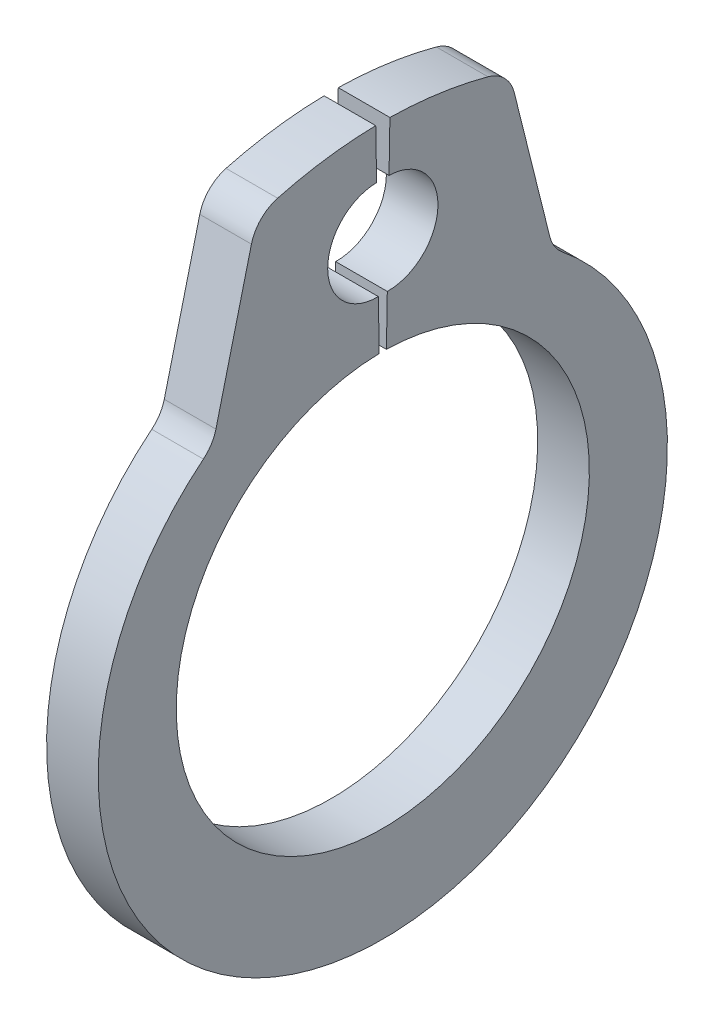
ISO-10303-21;
HEADER;
FILE_DESCRIPTION(('STEP AP214'),'2;1');
FILE_NAME('part.step','',(''),(''),'','','');
FILE_SCHEMA(('AUTOMOTIVE_DESIGN { 1 0 10303 214 1 1 1 1 }'));
ENDSEC;
DATA;
#1=APPLICATION_CONTEXT('core data for automotive mechanical design processes');
#2=APPLICATION_PROTOCOL_DEFINITION('international standard','automotive_design',2000,#1);
#3=PRODUCT_CONTEXT('',#1,'mechanical');
#4=PRODUCT('Part','Part','',(#3));
#5=PRODUCT_RELATED_PRODUCT_CATEGORY('part','',(#4));
#6=PRODUCT_DEFINITION_FORMATION('','',#4);
#7=PRODUCT_DEFINITION_CONTEXT('part definition',#1,'design');
#8=PRODUCT_DEFINITION('design','',#6,#7);
#9=PRODUCT_DEFINITION_SHAPE('','',#8);
#10=(LENGTH_UNIT() NAMED_UNIT(*) SI_UNIT(.MILLI.,.METRE.));
#11=(NAMED_UNIT(*) PLANE_ANGLE_UNIT() SI_UNIT($,.RADIAN.));
#12=(NAMED_UNIT(*) SI_UNIT($,.STERADIAN.) SOLID_ANGLE_UNIT());
#13=UNCERTAINTY_MEASURE_WITH_UNIT(LENGTH_MEASURE(1.E-05),#10,'distance_accuracy_value','');
#14=(GEOMETRIC_REPRESENTATION_CONTEXT(3) GLOBAL_UNCERTAINTY_ASSIGNED_CONTEXT((#13)) GLOBAL_UNIT_ASSIGNED_CONTEXT((#10,
#11,#12)) REPRESENTATION_CONTEXT('',''));
#15=CARTESIAN_POINT('',(0.,0.,0.));
#16=DIRECTION('',(0.,0.,1.));
#17=DIRECTION('',(1.,0.,0.));
#18=AXIS2_PLACEMENT_3D('',#15,#16,#17);
#19=CARTESIAN_POINT('',(0.35,0.,0.));
#20=DIRECTION('',(1.,0.,0.));
#21=DIRECTION('',(0.,0.,-1.));
#22=AXIS2_PLACEMENT_3D('',#19,#20,#21);
#23=PLANE('',#22);
#24=DIRECTION('',(0.,0.999847695156391,0.0174524064373034));
#25=VECTOR('',#24,1.);
#26=CARTESIAN_POINT('',(0.35,4.82426512913,0.08420786105989));
#27=LINE('',#26,#25);
#28=CARTESIAN_POINT('',(0.35,4.82426512912978,0.0842078610598862));
#29=VERTEX_POINT('',#28);
#30=CARTESIAN_POINT('',(0.35,5.49916232336025,0.0959882354050645));
#31=VERTEX_POINT('',#30);
#32=EDGE_CURVE('E130',#29,#31,#27,.T.);
#33=ORIENTED_EDGE('',*,*,#32,.T.);
#34=CARTESIAN_POINT('',(0.35,0.,0.));
#35=DIRECTION('',(-1.,0.,0.));
#36=DIRECTION('',(0.,0.,1.));
#37=AXIS2_PLACEMENT_3D('',#34,#35,#36);
#38=CIRCLE('',#37,5.5);
#39=CARTESIAN_POINT('',(0.35,5.31203501838707,1.42558197359135));
#40=VERTEX_POINT('',#39);
#41=EDGE_CURVE('E126',#31,#40,#38,.F.);
#42=ORIENTED_EDGE('',*,*,#41,.T.);
#43=CARTESIAN_POINT('',(0.35,4.829122743988,1.295983612356));
#44=DIRECTION('',(-1.,0.,0.));
#45=DIRECTION('',(0.,0.,1.));
#46=AXIS2_PLACEMENT_3D('',#43,#44,#45);
#47=CIRCLE('',#46,0.5);
#48=CARTESIAN_POINT('',(0.35,4.95008369178782,1.78113147549359));
#49=VERTEX_POINT('',#48);
#50=EDGE_CURVE('E20',#40,#49,#47,.F.);
#51=ORIENTED_EDGE('',*,*,#50,.T.);
#52=DIRECTION('',(0.,0.970295726275989,-0.241921895599697));
#53=VECTOR('',#52,1.);
#54=CARTESIAN_POINT('',(0.35,5.226710833704,1.712160582667));
#55=LINE('',#54,#53);
#56=CARTESIAN_POINT('',(0.35,3.01966775566306,2.26243822550396));
#57=VERTEX_POINT('',#56);
#58=EDGE_CURVE('E133',#49,#57,#55,.F.);
#59=ORIENTED_EDGE('',*,*,#58,.T.);
#60=CARTESIAN_POINT('',(0.35,3.140628703463,2.747586088642));
#61=DIRECTION('',(-1.,0.,0.));
#62=DIRECTION('',(0.,0.,1.));
#63=AXIS2_PLACEMENT_3D('',#60,#61,#62);
#64=CIRCLE('',#63,0.5);
#65=CARTESIAN_POINT('',(0.35,2.75252456841165,2.43234779725633));
#66=VERTEX_POINT('',#65);
#67=EDGE_CURVE('E212',#57,#66,#64,.T.);
#68=ORIENTED_EDGE('',*,*,#67,.T.);
#69=CARTESIAN_POINT('',(0.35,-0.2420489456372,0.));
#70=DIRECTION('',(-1.,0.,0.));
#71=DIRECTION('',(0.,0.,1.));
#72=AXIS2_PLACEMENT_3D('',#69,#70,#71);
#73=CIRCLE('',#72,3.857951054363);
#74=CARTESIAN_POINT('',(0.35,2.75252456841143,-2.43234779725615));
#75=VERTEX_POINT('',#74);
#76=EDGE_CURVE('E209',#75,#66,#73,.T.);
#77=ORIENTED_EDGE('',*,*,#76,.F.);
#78=CARTESIAN_POINT('',(0.35,3.140628703463,-2.747586088642));
#79=DIRECTION('',(-1.,0.,0.));
#80=DIRECTION('',(0.,0.,1.));
#81=AXIS2_PLACEMENT_3D('',#78,#79,#80);
#82=CIRCLE('',#81,0.5);
#83=CARTESIAN_POINT('',(0.35,3.01966775566305,-2.26243822550389));
#84=VERTEX_POINT('',#83);
#85=EDGE_CURVE('E206',#75,#84,#82,.T.);
#86=ORIENTED_EDGE('',*,*,#85,.T.);
#87=DIRECTION('',(0.,-0.970295726275989,-0.241921895599697));
#88=VECTOR('',#87,1.);
#89=CARTESIAN_POINT('',(0.35,5.226710833704,-1.712160582667));
#90=LINE('',#89,#88);
#91=CARTESIAN_POINT('',(0.35,4.95008369178782,-1.78113147549359));
#92=VERTEX_POINT('',#91);
#93=EDGE_CURVE('E163',#84,#92,#90,.F.);
#94=ORIENTED_EDGE('',*,*,#93,.T.);
#95=CARTESIAN_POINT('',(0.35,4.829122743988,-1.295983612356));
#96=DIRECTION('',(-1.,0.,0.));
#97=DIRECTION('',(0.,0.,1.));
#98=AXIS2_PLACEMENT_3D('',#95,#96,#97);
#99=CIRCLE('',#98,0.5);
#100=CARTESIAN_POINT('',(0.35,5.31203501838703,-1.42558197359133));
#101=VERTEX_POINT('',#100);
#102=EDGE_CURVE('E203',#101,#92,#99,.T.);
#103=ORIENTED_EDGE('',*,*,#102,.F.);
#104=CARTESIAN_POINT('',(0.35,0.,0.));
#105=DIRECTION('',(-1.,0.,0.));
#106=DIRECTION('',(0.,0.,1.));
#107=AXIS2_PLACEMENT_3D('',#104,#105,#106);
#108=CIRCLE('',#107,5.5);
#109=CARTESIAN_POINT('',(0.35,5.49916232336008,-0.0959882354050454));
#110=VERTEX_POINT('',#109);
#111=EDGE_CURVE('E199',#110,#101,#108,.T.);
#112=ORIENTED_EDGE('',*,*,#111,.F.);
#113=DIRECTION('',(0.,0.999847695156391,-0.0174524064372799));
#114=VECTOR('',#113,1.);
#115=CARTESIAN_POINT('',(0.35,4.82426512913,-0.08420786105989));
#116=LINE('',#115,#114);
#117=CARTESIAN_POINT('',(0.35,4.82426512912956,-0.0842078610598824));
#118=VERTEX_POINT('',#117);
#119=EDGE_CURVE('E158',#110,#118,#116,.F.);
#120=ORIENTED_EDGE('',*,*,#119,.T.);
#121=CARTESIAN_POINT('',(0.35,4.149367934899,-0.07242748671473));
#122=DIRECTION('',(-1.,0.,0.));
#123=DIRECTION('',(0.,0.,1.));
#124=AXIS2_PLACEMENT_3D('',#121,#122,#123);
#125=CIRCLE('',#124,0.675);
#126=CARTESIAN_POINT('',(0.35,3.47447074066822,-0.0606471123695479));
#127=VERTEX_POINT('',#126);
#128=EDGE_CURVE('E197',#118,#127,#125,.T.);
#129=ORIENTED_EDGE('',*,*,#128,.T.);
#130=DIRECTION('',(0.,0.999847695156391,-0.0174524064372799));
#131=VECTOR('',#130,1.);
#132=CARTESIAN_POINT('',(0.35,2.799573546438,-0.04886673802439));
#133=LINE('',#132,#131);
#134=CARTESIAN_POINT('',(0.35,2.7995735464379,-0.0488667380243882));
#135=VERTEX_POINT('',#134);
#136=EDGE_CURVE('E153',#127,#135,#133,.F.);
#137=ORIENTED_EDGE('',*,*,#136,.T.);
#138=CARTESIAN_POINT('',(0.35,0.,0.));
#139=DIRECTION('',(-1.,0.,0.));
#140=DIRECTION('',(0.,0.,1.));
#141=AXIS2_PLACEMENT_3D('',#138,#139,#140);
#142=CIRCLE('',#141,2.8);
#143=CARTESIAN_POINT('',(0.35,2.79957354643795,0.0488667380243971));
#144=VERTEX_POINT('',#143);
#145=EDGE_CURVE('E194',#135,#144,#142,.T.);
#146=ORIENTED_EDGE('',*,*,#145,.T.);
#147=DIRECTION('',(0.,0.999847695156391,0.0174524064373035));
#148=VECTOR('',#147,1.);
#149=CARTESIAN_POINT('',(0.35,2.799573546438,0.04886673802439));
#150=LINE('',#149,#148);
#151=CARTESIAN_POINT('',(0.35,3.47447074066844,0.0606471123695674));
#152=VERTEX_POINT('',#151);
#153=EDGE_CURVE('E144',#144,#152,#150,.T.);
#154=ORIENTED_EDGE('',*,*,#153,.T.);
#155=CARTESIAN_POINT('',(0.35,4.149367934899,0.07242748671473));
#156=DIRECTION('',(-1.,0.,0.));
#157=DIRECTION('',(0.,0.,1.));
#158=AXIS2_PLACEMENT_3D('',#155,#156,#157);
#159=CIRCLE('',#158,0.675);
#160=EDGE_CURVE('E146',#152,#29,#159,.T.);
#161=ORIENTED_EDGE('',*,*,#160,.T.);
#162=EDGE_LOOP('',(#33,#42,#51,#59,#68,#77,#86,#94,#103,#112,#120,#129,#137,#146,#154,#161));
#163=FACE_BOUND('',#162,.T.);
#164=ADVANCED_FACE('F17',(#163),#23,.T.);
#165=CARTESIAN_POINT('',(0.35,5.226710833704,1.712160582667));
#166=DIRECTION('',(0.,-0.241921895599697,-0.970295726275989));
#167=DIRECTION('',(0.,0.970295726275989,-0.241921895599697));
#168=AXIS2_PLACEMENT_3D('',#165,#166,#167);
#169=PLANE('',#168);
#170=ORIENTED_EDGE('',*,*,#58,.F.);
#171=DIRECTION('',(-1.,0.,0.));
#172=VECTOR('',#171,1.);
#173=CARTESIAN_POINT('',(0.35,4.95008369178799,1.78113147549396));
#174=LINE('',#173,#172);
#175=CARTESIAN_POINT('',(-0.35,4.95008369178783,1.78113147549402));
#176=VERTEX_POINT('',#175);
#177=EDGE_CURVE('E138',#176,#49,#174,.F.);
#178=ORIENTED_EDGE('',*,*,#177,.F.);
#179=DIRECTION('',(0.,-0.970295726276079,0.241921895599339));
#180=VECTOR('',#179,1.);
#181=CARTESIAN_POINT('',(-0.35,4.950083691788,1.781131475494));
#182=LINE('',#181,#180);
#183=CARTESIAN_POINT('',(-0.35,3.01966775566317,2.26243822550398));
#184=VERTEX_POINT('',#183);
#185=EDGE_CURVE('E193',#176,#184,#182,.T.);
#186=ORIENTED_EDGE('',*,*,#185,.T.);
#187=DIRECTION('',(-1.,0.,0.));
#188=VECTOR('',#187,1.);
#189=CARTESIAN_POINT('',(0.35,3.01966775566301,2.26243822550404));
#190=LINE('',#189,#188);
#191=EDGE_CURVE('E214',#184,#57,#190,.F.);
#192=ORIENTED_EDGE('',*,*,#191,.T.);
#193=EDGE_LOOP('',(#170,#178,#186,#192));
#194=FACE_BOUND('',#193,.T.);
#195=ADVANCED_FACE('F267',(#194),#169,.F.);
#196=CARTESIAN_POINT('',(0.35,3.140628703463,2.747586088642));
#197=DIRECTION('',(-1.,0.,0.));
#198=DIRECTION('',(0.,0.,1.));
#199=AXIS2_PLACEMENT_3D('',#196,#197,#198);
#200=CYLINDRICAL_SURFACE('',#199,0.5);
#201=CARTESIAN_POINT('',(-0.35,3.140628703463,2.747586088642));
#202=DIRECTION('',(-1.,0.,0.));
#203=DIRECTION('',(0.,0.,1.));
#204=AXIS2_PLACEMENT_3D('',#201,#202,#203);
#205=CIRCLE('',#204,0.5);
#206=CARTESIAN_POINT('',(-0.35,2.75252456841165,2.43234779725633));
#207=VERTEX_POINT('',#206);
#208=EDGE_CURVE('E190',#184,#207,#205,.T.);
#209=ORIENTED_EDGE('',*,*,#208,.T.);
#210=DIRECTION('',(-1.,0.,0.));
#211=VECTOR('',#210,1.);
#212=CARTESIAN_POINT('',(0.35,2.75252456841155,2.43234779725645));
#213=LINE('',#212,#211);
#214=EDGE_CURVE('E211',#66,#207,#213,.T.);
#215=ORIENTED_EDGE('',*,*,#214,.F.);
#216=ORIENTED_EDGE('',*,*,#67,.F.);
#217=ORIENTED_EDGE('',*,*,#191,.F.);
#218=EDGE_LOOP('',(#209,#215,#216,#217));
#219=FACE_BOUND('',#218,.T.);
#220=ADVANCED_FACE('F269',(#219),#200,.F.);
#221=CARTESIAN_POINT('',(0.35,-0.2420489456372,0.));
#222=DIRECTION('',(-1.,0.,0.));
#223=DIRECTION('',(0.,0.,1.));
#224=AXIS2_PLACEMENT_3D('',#221,#222,#223);
#225=CYLINDRICAL_SURFACE('',#224,3.857951054363);
#226=DIRECTION('',(-1.,0.,0.));
#227=VECTOR('',#226,1.);
#228=CARTESIAN_POINT('',(0.35,2.75252456841133,-2.43234779725627));
#229=LINE('',#228,#227);
#230=CARTESIAN_POINT('',(-0.35,2.75252456841143,-2.43234779725615));
#231=VERTEX_POINT('',#230);
#232=EDGE_CURVE('E208',#231,#75,#229,.F.);
#233=ORIENTED_EDGE('',*,*,#232,.T.);
#234=ORIENTED_EDGE('',*,*,#76,.T.);
#235=ORIENTED_EDGE('',*,*,#214,.T.);
#236=CARTESIAN_POINT('',(-0.35,-0.2420489456372,0.));
#237=DIRECTION('',(-1.,0.,0.));
#238=DIRECTION('',(0.,0.,1.));
#239=AXIS2_PLACEMENT_3D('',#236,#237,#238);
#240=CIRCLE('',#239,3.857951054363);
#241=EDGE_CURVE('E188',#207,#231,#240,.F.);
#242=ORIENTED_EDGE('',*,*,#241,.T.);
#243=EDGE_LOOP('',(#233,#234,#235,#242));
#244=FACE_BOUND('',#243,.T.);
#245=ADVANCED_FACE('F271',(#244),#225,.T.);
#246=CARTESIAN_POINT('',(0.35,3.140628703463,-2.747586088642));
#247=DIRECTION('',(-1.,0.,0.));
#248=DIRECTION('',(0.,0.,1.));
#249=AXIS2_PLACEMENT_3D('',#246,#247,#248);
#250=CYLINDRICAL_SURFACE('',#249,0.5);
#251=CARTESIAN_POINT('',(-0.35,3.140628703463,-2.747586088642));
#252=DIRECTION('',(-1.,0.,0.));
#253=DIRECTION('',(0.,0.,1.));
#254=AXIS2_PLACEMENT_3D('',#251,#252,#253);
#255=CIRCLE('',#254,0.5);
#256=CARTESIAN_POINT('',(-0.35,3.01966775566315,-2.26243822550391));
#257=VERTEX_POINT('',#256);
#258=EDGE_CURVE('E185',#231,#257,#255,.T.);
#259=ORIENTED_EDGE('',*,*,#258,.T.);
#260=DIRECTION('',(1.,0.,0.));
#261=VECTOR('',#260,1.);
#262=CARTESIAN_POINT('',(0.35,3.01966775566298,-2.26243822550391));
#263=LINE('',#262,#261);
#264=EDGE_CURVE('E165',#257,#84,#263,.T.);
#265=ORIENTED_EDGE('',*,*,#264,.T.);
#266=ORIENTED_EDGE('',*,*,#85,.F.);
#267=ORIENTED_EDGE('',*,*,#232,.F.);
#268=EDGE_LOOP('',(#259,#265,#266,#267));
#269=FACE_BOUND('',#268,.T.);
#270=ADVANCED_FACE('F277',(#269),#250,.F.);
#271=CARTESIAN_POINT('',(0.35,5.226710833704,-1.712160582667));
#272=DIRECTION('',(0.,-0.241921895599697,0.970295726275989));
#273=DIRECTION('',(0.,-0.970295726275989,-0.241921895599697));
#274=AXIS2_PLACEMENT_3D('',#271,#272,#273);
#275=PLANE('',#274);
#276=ORIENTED_EDGE('',*,*,#93,.F.);
#277=ORIENTED_EDGE('',*,*,#264,.F.);
#278=DIRECTION('',(0.,0.970295726276079,0.241921895599339));
#279=VECTOR('',#278,1.);
#280=CARTESIAN_POINT('',(-0.35,3.019667755663,-2.262438225504));
#281=LINE('',#280,#279);
#282=CARTESIAN_POINT('',(-0.35,4.95008369178783,-1.78113147549402));
#283=VERTEX_POINT('',#282);
#284=EDGE_CURVE('E184',#257,#283,#281,.T.);
#285=ORIENTED_EDGE('',*,*,#284,.T.);
#286=DIRECTION('',(-1.,0.,0.));
#287=VECTOR('',#286,1.);
#288=CARTESIAN_POINT('',(0.35,4.95008369178799,-1.78113147549396));
#289=LINE('',#288,#287);
#290=EDGE_CURVE('E164',#92,#283,#289,.T.);
#291=ORIENTED_EDGE('',*,*,#290,.F.);
#292=EDGE_LOOP('',(#276,#277,#285,#291));
#293=FACE_BOUND('',#292,.T.);
#294=ADVANCED_FACE('F281',(#293),#275,.F.);
#295=CARTESIAN_POINT('',(0.35,4.829122743988,-1.295983612356));
#296=DIRECTION('',(-1.,0.,0.));
#297=DIRECTION('',(0.,0.,1.));
#298=AXIS2_PLACEMENT_3D('',#295,#296,#297);
#299=CYLINDRICAL_SURFACE('',#298,0.5);
#300=DIRECTION('',(-1.,0.,0.));
#301=VECTOR('',#300,1.);
#302=CARTESIAN_POINT('',(0.35,5.31203501838723,-1.42558197359106));
#303=LINE('',#302,#301);
#304=CARTESIAN_POINT('',(-0.35,5.31203501838715,-1.42558197359137));
#305=VERTEX_POINT('',#304);
#306=EDGE_CURVE('E202',#101,#305,#303,.T.);
#307=ORIENTED_EDGE('',*,*,#306,.F.);
#308=ORIENTED_EDGE('',*,*,#102,.T.);
#309=ORIENTED_EDGE('',*,*,#290,.T.);
#310=CARTESIAN_POINT('',(-0.35,4.829122743988,-1.295983612356));
#311=DIRECTION('',(-1.,0.,0.));
#312=DIRECTION('',(0.,0.,1.));
#313=AXIS2_PLACEMENT_3D('',#310,#311,#312);
#314=CIRCLE('',#313,0.5);
#315=EDGE_CURVE('E181',#283,#305,#314,.F.);
#316=ORIENTED_EDGE('',*,*,#315,.T.);
#317=EDGE_LOOP('',(#307,#308,#309,#316));
#318=FACE_BOUND('',#317,.T.);
#319=ADVANCED_FACE('F284',(#318),#299,.T.);
#320=CARTESIAN_POINT('',(0.35,0.,0.));
#321=DIRECTION('',(-1.,0.,0.));
#322=DIRECTION('',(0.,0.,1.));
#323=AXIS2_PLACEMENT_3D('',#320,#321,#322);
#324=CYLINDRICAL_SURFACE('',#323,5.5);
#325=DIRECTION('',(1.,0.,0.));
#326=VECTOR('',#325,1.);
#327=CARTESIAN_POINT('',(0.35,5.49916232336,-0.0959882354050441));
#328=LINE('',#327,#326);
#329=CARTESIAN_POINT('',(-0.35,5.49916232336008,-0.0959882354050534));
#330=VERTEX_POINT('',#329);
#331=EDGE_CURVE('E162',#330,#110,#328,.T.);
#332=ORIENTED_EDGE('',*,*,#331,.T.);
#333=ORIENTED_EDGE('',*,*,#111,.T.);
#334=ORIENTED_EDGE('',*,*,#306,.T.);
#335=CARTESIAN_POINT('',(-0.35,0.,0.));
#336=DIRECTION('',(-1.,0.,0.));
#337=DIRECTION('',(0.,0.,1.));
#338=AXIS2_PLACEMENT_3D('',#335,#336,#337);
#339=CIRCLE('',#338,5.5);
#340=EDGE_CURVE('E178',#305,#330,#339,.F.);
#341=ORIENTED_EDGE('',*,*,#340,.T.);
#342=EDGE_LOOP('',(#332,#333,#334,#341));
#343=FACE_BOUND('',#342,.T.);
#344=ADVANCED_FACE('F289',(#343),#324,.T.);
#345=CARTESIAN_POINT('',(0.35,4.82426512913,-0.08420786105989));
#346=DIRECTION('',(0.,-0.0174524064372799,-0.999847695156391));
#347=DIRECTION('',(0.,0.999847695156391,-0.0174524064372799));
#348=AXIS2_PLACEMENT_3D('',#345,#346,#347);
#349=PLANE('',#348);
#350=ORIENTED_EDGE('',*,*,#119,.F.);
#351=ORIENTED_EDGE('',*,*,#331,.F.);
#352=DIRECTION('',(0.,-0.999847695156391,0.0174524064373034));
#353=VECTOR('',#352,1.);
#354=CARTESIAN_POINT('',(-0.35,5.49916232336,-0.09598823540506));
#355=LINE('',#354,#353);
#356=CARTESIAN_POINT('',(-0.35,4.82426512912956,-0.0842078610598824));
#357=VERTEX_POINT('',#356);
#358=EDGE_CURVE('E177',#330,#357,#355,.T.);
#359=ORIENTED_EDGE('',*,*,#358,.T.);
#360=DIRECTION('',(-1.,0.,0.));
#361=VECTOR('',#360,1.);
#362=CARTESIAN_POINT('',(0.35,4.82426512912956,-0.0842078610598824));
#363=LINE('',#362,#361);
#364=EDGE_CURVE('E161',#357,#118,#363,.F.);
#365=ORIENTED_EDGE('',*,*,#364,.T.);
#366=EDGE_LOOP('',(#350,#351,#359,#365));
#367=FACE_BOUND('',#366,.T.);
#368=ADVANCED_FACE('F292',(#367),#349,.F.);
#369=CARTESIAN_POINT('',(0.35,4.149367934899,-0.07242748671473));
#370=DIRECTION('',(-1.,0.,0.));
#371=DIRECTION('',(0.,0.,1.));
#372=AXIS2_PLACEMENT_3D('',#369,#370,#371);
#373=CYLINDRICAL_SURFACE('',#372,0.675);
#374=DIRECTION('',(1.,0.,0.));
#375=VECTOR('',#374,1.);
#376=CARTESIAN_POINT('',(0.35,3.474470740668,-0.0606471123695441));
#377=LINE('',#376,#375);
#378=CARTESIAN_POINT('',(-0.35,3.47447074066822,-0.0606471123695558));
#379=VERTEX_POINT('',#378);
#380=EDGE_CURVE('E157',#379,#127,#377,.T.);
#381=ORIENTED_EDGE('',*,*,#380,.T.);
#382=ORIENTED_EDGE('',*,*,#128,.F.);
#383=ORIENTED_EDGE('',*,*,#364,.F.);
#384=CARTESIAN_POINT('',(-0.35,4.149367934899,-0.07242748671473));
#385=DIRECTION('',(-1.,0.,0.));
#386=DIRECTION('',(0.,0.,1.));
#387=AXIS2_PLACEMENT_3D('',#384,#385,#386);
#388=CIRCLE('',#387,0.675);
#389=EDGE_CURVE('E175',#357,#379,#388,.T.);
#390=ORIENTED_EDGE('',*,*,#389,.T.);
#391=EDGE_LOOP('',(#381,#382,#383,#390));
#392=FACE_BOUND('',#391,.T.);
#393=ADVANCED_FACE('F294',(#392),#373,.F.);
#394=CARTESIAN_POINT('',(0.35,2.799573546438,-0.04886673802439));
#395=DIRECTION('',(0.,-0.0174524064372799,-0.999847695156391));
#396=DIRECTION('',(0.,0.999847695156391,-0.0174524064372799));
#397=AXIS2_PLACEMENT_3D('',#394,#395,#396);
#398=PLANE('',#397);
#399=ORIENTED_EDGE('',*,*,#136,.F.);
#400=ORIENTED_EDGE('',*,*,#380,.F.);
#401=DIRECTION('',(0.,-0.999847695156391,0.0174524064373035));
#402=VECTOR('',#401,1.);
#403=CARTESIAN_POINT('',(-0.35,3.474470740668,-0.06064711236956));
#404=LINE('',#403,#402);
#405=CARTESIAN_POINT('',(-0.35,2.7995735464379,-0.0488667380243882));
#406=VERTEX_POINT('',#405);
#407=EDGE_CURVE('E174',#379,#406,#404,.T.);
#408=ORIENTED_EDGE('',*,*,#407,.T.);
#409=DIRECTION('',(-1.,0.,0.));
#410=VECTOR('',#409,1.);
#411=CARTESIAN_POINT('',(0.35,2.7995735464379,-0.0488667380243881));
#412=LINE('',#411,#410);
#413=EDGE_CURVE('E156',#406,#135,#412,.F.);
#414=ORIENTED_EDGE('',*,*,#413,.T.);
#415=EDGE_LOOP('',(#399,#400,#408,#414));
#416=FACE_BOUND('',#415,.T.);
#417=ADVANCED_FACE('F300',(#416),#398,.F.);
#418=CARTESIAN_POINT('',(0.35,0.,0.));
#419=DIRECTION('',(-1.,0.,0.));
#420=DIRECTION('',(0.,0.,1.));
#421=AXIS2_PLACEMENT_3D('',#418,#419,#420);
#422=CYLINDRICAL_SURFACE('',#421,2.8);
#423=CARTESIAN_POINT('',(-0.35,0.,0.));
#424=DIRECTION('',(-1.,0.,0.));
#425=DIRECTION('',(0.,0.,1.));
#426=AXIS2_PLACEMENT_3D('',#423,#424,#425);
#427=CIRCLE('',#426,2.8);
#428=CARTESIAN_POINT('',(-0.35,2.79957354643795,0.0488667380243971));
#429=VERTEX_POINT('',#428);
#430=EDGE_CURVE('E172',#406,#429,#427,.T.);
#431=ORIENTED_EDGE('',*,*,#430,.T.);
#432=DIRECTION('',(1.,0.,0.));
#433=VECTOR('',#432,1.);
#434=CARTESIAN_POINT('',(0.35,2.799573546438,0.0488667380244059));
#435=LINE('',#434,#433);
#436=EDGE_CURVE('E196',#429,#144,#435,.T.);
#437=ORIENTED_EDGE('',*,*,#436,.T.);
#438=ORIENTED_EDGE('',*,*,#145,.F.);
#439=ORIENTED_EDGE('',*,*,#413,.F.);
#440=EDGE_LOOP('',(#431,#437,#438,#439));
#441=FACE_BOUND('',#440,.T.);
#442=ADVANCED_FACE('F303',(#441),#422,.F.);
#443=CARTESIAN_POINT('',(0.35,3.474470740668,0.06064711236956));
#444=DIRECTION('',(0.,-0.0174524064372799,0.999847695156391));
#445=DIRECTION('',(0.,-0.999847695156391,-0.0174524064372799));
#446=AXIS2_PLACEMENT_3D('',#443,#444,#445);
#447=PLANE('',#446);
#448=ORIENTED_EDGE('',*,*,#153,.F.);
#449=ORIENTED_EDGE('',*,*,#436,.F.);
#450=DIRECTION('',(0.,0.999847695156391,0.0174524064373035));
#451=VECTOR('',#450,1.);
#452=CARTESIAN_POINT('',(-0.35,2.799573546438,0.04886673802439));
#453=LINE('',#452,#451);
#454=CARTESIAN_POINT('',(-0.35,3.47447074066844,0.0606471123695674));
#455=VERTEX_POINT('',#454);
#456=EDGE_CURVE('E171',#429,#455,#453,.T.);
#457=ORIENTED_EDGE('',*,*,#456,.T.);
#458=DIRECTION('',(-1.,0.,0.));
#459=VECTOR('',#458,1.);
#460=CARTESIAN_POINT('',(0.35,3.47447074066844,0.0606471123695672));
#461=LINE('',#460,#459);
#462=EDGE_CURVE('E237',#455,#152,#461,.F.);
#463=ORIENTED_EDGE('',*,*,#462,.T.);
#464=EDGE_LOOP('',(#448,#449,#457,#463));
#465=FACE_BOUND('',#464,.T.);
#466=ADVANCED_FACE('F305',(#465),#447,.F.);
#467=CARTESIAN_POINT('',(0.35,4.149367934899,0.07242748671473));
#468=DIRECTION('',(-1.,0.,0.));
#469=DIRECTION('',(0.,0.,1.));
#470=AXIS2_PLACEMENT_3D('',#467,#468,#469);
#471=CYLINDRICAL_SURFACE('',#470,0.675);
#472=CARTESIAN_POINT('',(-0.35,4.149367934899,0.07242748671473));
#473=DIRECTION('',(-1.,0.,0.));
#474=DIRECTION('',(0.,0.,1.));
#475=AXIS2_PLACEMENT_3D('',#472,#473,#474);
#476=CIRCLE('',#475,0.675);
#477=CARTESIAN_POINT('',(-0.35,4.82426512912978,0.0842078610598862));
#478=VERTEX_POINT('',#477);
#479=EDGE_CURVE('E169',#455,#478,#476,.T.);
#480=ORIENTED_EDGE('',*,*,#479,.T.);
#481=DIRECTION('',(1.,0.,0.));
#482=VECTOR('',#481,1.);
#483=CARTESIAN_POINT('',(0.35,4.82426512913,0.08420786105989));
#484=LINE('',#483,#482);
#485=EDGE_CURVE('E239',#478,#29,#484,.T.);
#486=ORIENTED_EDGE('',*,*,#485,.T.);
#487=ORIENTED_EDGE('',*,*,#160,.F.);
#488=ORIENTED_EDGE('',*,*,#462,.F.);
#489=EDGE_LOOP('',(#480,#486,#487,#488));
#490=FACE_BOUND('',#489,.T.);
#491=ADVANCED_FACE('F307',(#490),#471,.F.);
#492=CARTESIAN_POINT('',(0.35,4.82426512913,0.08420786105989));
#493=DIRECTION('',(0.,-0.0174524064372799,0.999847695156391));
#494=DIRECTION('',(0.,-0.999847695156391,-0.0174524064372799));
#495=AXIS2_PLACEMENT_3D('',#492,#493,#494);
#496=PLANE('',#495);
#497=ORIENTED_EDGE('',*,*,#32,.F.);
#498=ORIENTED_EDGE('',*,*,#485,.F.);
#499=DIRECTION('',(0.,0.999847695156391,0.0174524064373034));
#500=VECTOR('',#499,1.);
#501=CARTESIAN_POINT('',(-0.35,4.82426512913,0.08420786105989));
#502=LINE('',#501,#500);
#503=CARTESIAN_POINT('',(-0.35,5.49916232336025,0.0959882354050645));
#504=VERTEX_POINT('',#503);
#505=EDGE_CURVE('E168',#478,#504,#502,.T.);
#506=ORIENTED_EDGE('',*,*,#505,.T.);
#507=DIRECTION('',(-1.,0.,0.));
#508=VECTOR('',#507,1.);
#509=CARTESIAN_POINT('',(0.35,5.49916232336025,0.0959882354050647));
#510=LINE('',#509,#508);
#511=EDGE_CURVE('E139',#31,#504,#510,.T.);
#512=ORIENTED_EDGE('',*,*,#511,.F.);
#513=EDGE_LOOP('',(#497,#498,#506,#512));
#514=FACE_BOUND('',#513,.T.);
#515=ADVANCED_FACE('F258',(#514),#496,.F.);
#516=CARTESIAN_POINT('',(0.35,0.,0.));
#517=DIRECTION('',(-1.,0.,0.));
#518=DIRECTION('',(0.,0.,1.));
#519=AXIS2_PLACEMENT_3D('',#516,#517,#518);
#520=CYLINDRICAL_SURFACE('',#519,5.5);
#521=ORIENTED_EDGE('',*,*,#511,.T.);
#522=CARTESIAN_POINT('',(-0.35,0.,0.));
#523=DIRECTION('',(-1.,0.,0.));
#524=DIRECTION('',(0.,0.,1.));
#525=AXIS2_PLACEMENT_3D('',#522,#523,#524);
#526=CIRCLE('',#525,5.5);
#527=CARTESIAN_POINT('',(-0.35,5.31203501838691,1.4255819735913));
#528=VERTEX_POINT('',#527);
#529=EDGE_CURVE('E26',#504,#528,#526,.F.);
#530=ORIENTED_EDGE('',*,*,#529,.T.);
#531=DIRECTION('',(-1.,0.,0.));
#532=VECTOR('',#531,1.);
#533=CARTESIAN_POINT('',(0.35,5.31203501838699,1.425581973591));
#534=LINE('',#533,#532);
#535=EDGE_CURVE('E34',#40,#528,#534,.T.);
#536=ORIENTED_EDGE('',*,*,#535,.F.);
#537=ORIENTED_EDGE('',*,*,#41,.F.);
#538=EDGE_LOOP('',(#521,#530,#536,#537));
#539=FACE_BOUND('',#538,.T.);
#540=ADVANCED_FACE('F136',(#539),#520,.T.);
#541=CARTESIAN_POINT('',(0.35,4.829122743988,1.295983612356));
#542=DIRECTION('',(-1.,0.,0.));
#543=DIRECTION('',(0.,0.,1.));
#544=AXIS2_PLACEMENT_3D('',#541,#542,#543);
#545=CYLINDRICAL_SURFACE('',#544,0.5);
#546=ORIENTED_EDGE('',*,*,#177,.T.);
#547=ORIENTED_EDGE('',*,*,#50,.F.);
#548=ORIENTED_EDGE('',*,*,#535,.T.);
#549=CARTESIAN_POINT('',(-0.35,4.829122743988,1.295983612356));
#550=DIRECTION('',(-1.,0.,0.));
#551=DIRECTION('',(0.,0.,1.));
#552=AXIS2_PLACEMENT_3D('',#549,#550,#551);
#553=CIRCLE('',#552,0.5);
#554=EDGE_CURVE('E11',#528,#176,#553,.F.);
#555=ORIENTED_EDGE('',*,*,#554,.T.);
#556=EDGE_LOOP('',(#546,#547,#548,#555));
#557=FACE_BOUND('',#556,.T.);
#558=ADVANCED_FACE('F142',(#557),#545,.T.);
#559=CARTESIAN_POINT('',(-0.35,0.,0.));
#560=DIRECTION('',(1.,0.,0.));
#561=DIRECTION('',(0.,0.,-1.));
#562=AXIS2_PLACEMENT_3D('',#559,#560,#561);
#563=PLANE('',#562);
#564=ORIENTED_EDGE('',*,*,#529,.F.);
#565=ORIENTED_EDGE('',*,*,#505,.F.);
#566=ORIENTED_EDGE('',*,*,#479,.F.);
#567=ORIENTED_EDGE('',*,*,#456,.F.);
#568=ORIENTED_EDGE('',*,*,#430,.F.);
#569=ORIENTED_EDGE('',*,*,#407,.F.);
#570=ORIENTED_EDGE('',*,*,#389,.F.);
#571=ORIENTED_EDGE('',*,*,#358,.F.);
#572=ORIENTED_EDGE('',*,*,#340,.F.);
#573=ORIENTED_EDGE('',*,*,#315,.F.);
#574=ORIENTED_EDGE('',*,*,#284,.F.);
#575=ORIENTED_EDGE('',*,*,#258,.F.);
#576=ORIENTED_EDGE('',*,*,#241,.F.);
#577=ORIENTED_EDGE('',*,*,#208,.F.);
#578=ORIENTED_EDGE('',*,*,#185,.F.);
#579=ORIENTED_EDGE('',*,*,#554,.F.);
#580=EDGE_LOOP('',(#564,#565,#566,#567,#568,#569,#570,#571,#572,#573,#574,#575,#576,#577,#578,#579));
#581=FACE_BOUND('',#580,.T.);
#582=ADVANCED_FACE('F261',(#581),#563,.F.);
#583=CLOSED_SHELL('',(#164,#195,#220,#245,#270,#294,#319,#344,#368,#393,#417,#442,#466,#491,
#515,#540,#558,#582));
#584=MANIFOLD_SOLID_BREP('B1',#583);
#585=ADVANCED_BREP_SHAPE_REPRESENTATION('',(#18,#584),#14);
#586=SHAPE_DEFINITION_REPRESENTATION(#9,#585);
ENDSEC;
END-ISO-10303-21;
